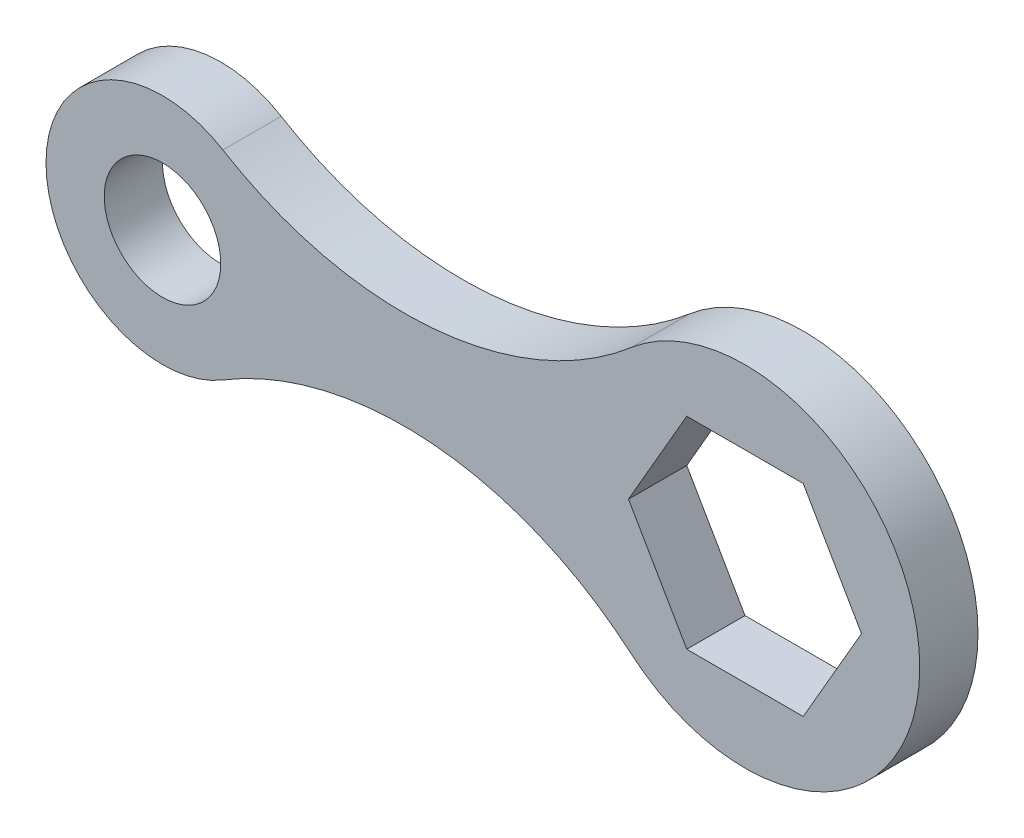
ISO-10303-21;
HEADER;
FILE_DESCRIPTION(('STEP AP214'),'2;1');
FILE_NAME('part.step','',(''),(''),'','','');
FILE_SCHEMA(('AUTOMOTIVE_DESIGN { 1 0 10303 214 1 1 1 1 }'));
ENDSEC;
DATA;
#1=APPLICATION_CONTEXT('core data for automotive mechanical design processes');
#2=APPLICATION_PROTOCOL_DEFINITION('international standard','automotive_design',2000,#1);
#3=PRODUCT_CONTEXT('',#1,'mechanical');
#4=PRODUCT('Part','Part','',(#3));
#5=PRODUCT_RELATED_PRODUCT_CATEGORY('part','',(#4));
#6=PRODUCT_DEFINITION_FORMATION('','',#4);
#7=PRODUCT_DEFINITION_CONTEXT('part definition',#1,'design');
#8=PRODUCT_DEFINITION('design','',#6,#7);
#9=PRODUCT_DEFINITION_SHAPE('','',#8);
#10=(LENGTH_UNIT() NAMED_UNIT(*) SI_UNIT(.MILLI.,.METRE.));
#11=(NAMED_UNIT(*) PLANE_ANGLE_UNIT() SI_UNIT($,.RADIAN.));
#12=(NAMED_UNIT(*) SI_UNIT($,.STERADIAN.) SOLID_ANGLE_UNIT());
#13=UNCERTAINTY_MEASURE_WITH_UNIT(LENGTH_MEASURE(1.E-05),#10,'distance_accuracy_value','');
#14=(GEOMETRIC_REPRESENTATION_CONTEXT(3) GLOBAL_UNCERTAINTY_ASSIGNED_CONTEXT((#13)) GLOBAL_UNIT_ASSIGNED_CONTEXT((#10,
#11,#12)) REPRESENTATION_CONTEXT('',''));
#15=CARTESIAN_POINT('',(0.,0.,0.));
#16=DIRECTION('',(0.,0.,1.));
#17=DIRECTION('',(1.,0.,0.));
#18=AXIS2_PLACEMENT_3D('',#15,#16,#17);
#19=CARTESIAN_POINT('',(-29.25,34.197039345534,5.));
#20=DIRECTION('',(0.,0.,1.));
#21=DIRECTION('',(1.,0.,0.));
#22=AXIS2_PLACEMENT_3D('',#19,#20,#21);
#23=PLANE('',#22);
#24=DIRECTION('',(0.5,-0.866025403784438,0.));
#25=VECTOR('',#24,1.);
#26=CARTESIAN_POINT('',(-20.,0.,5.));
#27=LINE('',#26,#25);
#28=CARTESIAN_POINT('',(-20.,0.,5.));
#29=VERTEX_POINT('',#28);
#30=CARTESIAN_POINT('',(-10.,-17.3205080756888,5.));
#31=VERTEX_POINT('',#30);
#32=EDGE_CURVE('E130',#29,#31,#27,.T.);
#33=ORIENTED_EDGE('',*,*,#32,.F.);
#34=DIRECTION('',(-0.5,-0.866025403784439,0.));
#35=VECTOR('',#34,1.);
#36=CARTESIAN_POINT('',(-10.,17.3205080756888,5.));
#37=LINE('',#36,#35);
#38=CARTESIAN_POINT('',(-10.,17.3205080756888,5.));
#39=VERTEX_POINT('',#38);
#40=EDGE_CURVE('E121',#39,#29,#37,.T.);
#41=ORIENTED_EDGE('',*,*,#40,.F.);
#42=DIRECTION('',(-1.,0.,0.));
#43=VECTOR('',#42,1.);
#44=CARTESIAN_POINT('',(10.,17.3205080756888,5.));
#45=LINE('',#44,#43);
#46=CARTESIAN_POINT('',(10.,17.3205080756888,5.));
#47=VERTEX_POINT('',#46);
#48=EDGE_CURVE('E158',#47,#39,#45,.T.);
#49=ORIENTED_EDGE('',*,*,#48,.F.);
#50=DIRECTION('',(-0.5,0.866025403784438,0.));
#51=VECTOR('',#50,1.);
#52=CARTESIAN_POINT('',(20.,0.,5.));
#53=LINE('',#52,#51);
#54=CARTESIAN_POINT('',(20.,0.,5.));
#55=VERTEX_POINT('',#54);
#56=EDGE_CURVE('E155',#55,#47,#53,.T.);
#57=ORIENTED_EDGE('',*,*,#56,.F.);
#58=DIRECTION('',(0.5,0.866025403784439,0.));
#59=VECTOR('',#58,1.);
#60=CARTESIAN_POINT('',(10.,-17.3205080756888,5.));
#61=LINE('',#60,#59);
#62=CARTESIAN_POINT('',(10.,-17.3205080756888,5.));
#63=VERTEX_POINT('',#62);
#64=EDGE_CURVE('E149',#63,#55,#61,.T.);
#65=ORIENTED_EDGE('',*,*,#64,.F.);
#66=DIRECTION('',(1.,0.,0.));
#67=VECTOR('',#66,1.);
#68=CARTESIAN_POINT('',(-10.,-17.3205080756888,5.));
#69=LINE('',#68,#67);
#70=EDGE_CURVE('E145',#31,#63,#69,.T.);
#71=ORIENTED_EDGE('',*,*,#70,.F.);
#72=EDGE_LOOP('',(#33,#41,#49,#57,#65,#71));
#73=FACE_BOUND('',#72,.T.);
#74=CARTESIAN_POINT('',(-58.5,68.394078691068,5.));
#75=DIRECTION('',(0.,0.,-1.));
#76=DIRECTION('',(1.,0.,0.));
#77=AXIS2_PLACEMENT_3D('',#74,#75,#76);
#78=CIRCLE('',#77,60.);
#79=CARTESIAN_POINT('',(-19.5,22.798026230356,5.));
#80=VERTEX_POINT('',#79);
#81=CARTESIAN_POINT('',(-89.625,17.098519672767,5.));
#82=VERTEX_POINT('',#81);
#83=EDGE_CURVE('E193',#80,#82,#78,.T.);
#84=ORIENTED_EDGE('',*,*,#83,.T.);
#85=CARTESIAN_POINT('',(-100.,0.,5.));
#86=DIRECTION('',(0.,0.,1.));
#87=DIRECTION('',(1.,0.,0.));
#88=AXIS2_PLACEMENT_3D('',#85,#86,#87);
#89=CIRCLE('',#88,20.);
#90=CARTESIAN_POINT('',(-89.625,-17.098519672767,5.));
#91=VERTEX_POINT('',#90);
#92=EDGE_CURVE('E197',#82,#91,#89,.T.);
#93=ORIENTED_EDGE('',*,*,#92,.T.);
#94=CARTESIAN_POINT('',(-58.5,-68.394078691068,5.));
#95=DIRECTION('',(0.,0.,-1.));
#96=DIRECTION('',(-1.,0.,0.));
#97=AXIS2_PLACEMENT_3D('',#94,#95,#96);
#98=CIRCLE('',#97,60.);
#99=CARTESIAN_POINT('',(-19.5,-22.798026230356,5.));
#100=VERTEX_POINT('',#99);
#101=EDGE_CURVE('E201',#91,#100,#98,.T.);
#102=ORIENTED_EDGE('',*,*,#101,.T.);
#103=CARTESIAN_POINT('',(0.,0.,5.));
#104=DIRECTION('',(0.,0.,1.));
#105=DIRECTION('',(1.,0.,0.));
#106=AXIS2_PLACEMENT_3D('',#103,#104,#105);
#107=CIRCLE('',#106,30.);
#108=EDGE_CURVE('E204',#100,#80,#107,.T.);
#109=ORIENTED_EDGE('',*,*,#108,.T.);
#110=EDGE_LOOP('',(#84,#93,#102,#109));
#111=FACE_BOUND('',#110,.T.);
#112=CARTESIAN_POINT('',(-100.,0.,5.));
#113=DIRECTION('',(0.,0.,1.));
#114=DIRECTION('',(1.,0.,0.));
#115=AXIS2_PLACEMENT_3D('',#112,#113,#114);
#116=CIRCLE('',#115,10.);
#117=CARTESIAN_POINT('',(-90.,0.,5.));
#118=VERTEX_POINT('',#117);
#119=EDGE_CURVE('E163',#118,#118,#116,.T.);
#120=ORIENTED_EDGE('',*,*,#119,.F.);
#121=EDGE_LOOP('',(#120));
#122=FACE_BOUND('',#121,.T.);
#123=ADVANCED_FACE('F43',(#73,#111,#122),#23,.T.);
#124=CARTESIAN_POINT('',(-29.25,34.197039345534,-5.));
#125=DIRECTION('',(0.,0.,1.));
#126=DIRECTION('',(1.,0.,0.));
#127=AXIS2_PLACEMENT_3D('',#124,#125,#126);
#128=PLANE('',#127);
#129=CARTESIAN_POINT('',(-58.5,68.394078691068,-5.));
#130=DIRECTION('',(0.,0.,-1.));
#131=DIRECTION('',(1.,0.,0.));
#132=AXIS2_PLACEMENT_3D('',#129,#130,#131);
#133=CIRCLE('',#132,60.);
#134=CARTESIAN_POINT('',(-19.5,22.798026230356,-5.));
#135=VERTEX_POINT('',#134);
#136=CARTESIAN_POINT('',(-89.625,17.098519672767,-5.));
#137=VERTEX_POINT('',#136);
#138=EDGE_CURVE('E139',#135,#137,#133,.T.);
#139=ORIENTED_EDGE('',*,*,#138,.F.);
#140=CARTESIAN_POINT('',(0.,0.,-5.));
#141=DIRECTION('',(0.,0.,1.));
#142=DIRECTION('',(1.,0.,0.));
#143=AXIS2_PLACEMENT_3D('',#140,#141,#142);
#144=CIRCLE('',#143,30.);
#145=CARTESIAN_POINT('',(-19.5,-22.798026230356,-5.));
#146=VERTEX_POINT('',#145);
#147=EDGE_CURVE('E198',#146,#135,#144,.T.);
#148=ORIENTED_EDGE('',*,*,#147,.F.);
#149=CARTESIAN_POINT('',(-58.5,-68.394078691068,-5.));
#150=DIRECTION('',(0.,0.,-1.));
#151=DIRECTION('',(-1.,0.,0.));
#152=AXIS2_PLACEMENT_3D('',#149,#150,#151);
#153=CIRCLE('',#152,60.);
#154=CARTESIAN_POINT('',(-89.625,-17.098519672767,-5.));
#155=VERTEX_POINT('',#154);
#156=EDGE_CURVE('E214',#155,#146,#153,.T.);
#157=ORIENTED_EDGE('',*,*,#156,.F.);
#158=CARTESIAN_POINT('',(-100.,0.,-5.));
#159=DIRECTION('',(0.,0.,1.));
#160=DIRECTION('',(1.,0.,0.));
#161=AXIS2_PLACEMENT_3D('',#158,#159,#160);
#162=CIRCLE('',#161,20.);
#163=EDGE_CURVE('E211',#137,#155,#162,.T.);
#164=ORIENTED_EDGE('',*,*,#163,.F.);
#165=EDGE_LOOP('',(#139,#148,#157,#164));
#166=FACE_BOUND('',#165,.T.);
#167=DIRECTION('',(-0.5,-0.866025403784439,0.));
#168=VECTOR('',#167,1.);
#169=CARTESIAN_POINT('',(-10.,17.3205080756888,-5.));
#170=LINE('',#169,#168);
#171=CARTESIAN_POINT('',(-10.,17.3205080756888,-5.));
#172=VERTEX_POINT('',#171);
#173=CARTESIAN_POINT('',(-20.,0.,-5.));
#174=VERTEX_POINT('',#173);
#175=EDGE_CURVE('E67',#172,#174,#170,.T.);
#176=ORIENTED_EDGE('',*,*,#175,.T.);
#177=DIRECTION('',(0.5,-0.866025403784438,0.));
#178=VECTOR('',#177,1.);
#179=CARTESIAN_POINT('',(-20.,0.,-5.));
#180=LINE('',#179,#178);
#181=CARTESIAN_POINT('',(-10.,-17.3205080756888,-5.));
#182=VERTEX_POINT('',#181);
#183=EDGE_CURVE('E137',#174,#182,#180,.T.);
#184=ORIENTED_EDGE('',*,*,#183,.T.);
#185=DIRECTION('',(1.,0.,0.));
#186=VECTOR('',#185,1.);
#187=CARTESIAN_POINT('',(-10.,-17.3205080756888,-5.));
#188=LINE('',#187,#186);
#189=CARTESIAN_POINT('',(10.,-17.3205080756888,-5.));
#190=VERTEX_POINT('',#189);
#191=EDGE_CURVE('E166',#182,#190,#188,.T.);
#192=ORIENTED_EDGE('',*,*,#191,.T.);
#193=DIRECTION('',(0.5,0.866025403784439,0.));
#194=VECTOR('',#193,1.);
#195=CARTESIAN_POINT('',(10.,-17.3205080756888,-5.));
#196=LINE('',#195,#194);
#197=CARTESIAN_POINT('',(20.,0.,-5.));
#198=VERTEX_POINT('',#197);
#199=EDGE_CURVE('E170',#190,#198,#196,.T.);
#200=ORIENTED_EDGE('',*,*,#199,.T.);
#201=DIRECTION('',(-0.5,0.866025403784438,0.));
#202=VECTOR('',#201,1.);
#203=CARTESIAN_POINT('',(20.,0.,-5.));
#204=LINE('',#203,#202);
#205=CARTESIAN_POINT('',(10.,17.3205080756888,-5.));
#206=VERTEX_POINT('',#205);
#207=EDGE_CURVE('E174',#198,#206,#204,.T.);
#208=ORIENTED_EDGE('',*,*,#207,.T.);
#209=DIRECTION('',(-1.,0.,0.));
#210=VECTOR('',#209,1.);
#211=CARTESIAN_POINT('',(10.,17.3205080756888,-5.));
#212=LINE('',#211,#210);
#213=EDGE_CURVE('E131',#206,#172,#212,.T.);
#214=ORIENTED_EDGE('',*,*,#213,.T.);
#215=EDGE_LOOP('',(#176,#184,#192,#200,#208,#214));
#216=FACE_BOUND('',#215,.T.);
#217=CARTESIAN_POINT('',(-100.,0.,-5.));
#218=DIRECTION('',(0.,0.,1.));
#219=DIRECTION('',(1.,0.,0.));
#220=AXIS2_PLACEMENT_3D('',#217,#218,#219);
#221=CIRCLE('',#220,10.);
#222=CARTESIAN_POINT('',(-90.,0.,-5.));
#223=VERTEX_POINT('',#222);
#224=EDGE_CURVE('E298',#223,#223,#221,.T.);
#225=ORIENTED_EDGE('',*,*,#224,.T.);
#226=EDGE_LOOP('',(#225));
#227=FACE_BOUND('',#226,.T.);
#228=ADVANCED_FACE('F237',(#166,#216,#227),#128,.F.);
#229=CARTESIAN_POINT('',(-58.5,68.394078691068,5.));
#230=DIRECTION('',(0.,0.,-1.));
#231=DIRECTION('',(-1.,0.,0.));
#232=AXIS2_PLACEMENT_3D('',#229,#230,#231);
#233=CYLINDRICAL_SURFACE('',#232,60.);
#234=ORIENTED_EDGE('',*,*,#138,.T.);
#235=DIRECTION('',(0.,0.,-1.));
#236=VECTOR('',#235,1.);
#237=CARTESIAN_POINT('',(-89.625,17.098519672767,5.));
#238=LINE('',#237,#236);
#239=EDGE_CURVE('E11',#82,#137,#238,.T.);
#240=ORIENTED_EDGE('',*,*,#239,.F.);
#241=ORIENTED_EDGE('',*,*,#83,.F.);
#242=DIRECTION('',(0.,0.,-1.));
#243=VECTOR('',#242,1.);
#244=CARTESIAN_POINT('',(-19.5,22.798026230356,5.));
#245=LINE('',#244,#243);
#246=EDGE_CURVE('E207',#80,#135,#245,.T.);
#247=ORIENTED_EDGE('',*,*,#246,.T.);
#248=EDGE_LOOP('',(#234,#240,#241,#247));
#249=FACE_BOUND('',#248,.T.);
#250=ADVANCED_FACE('F45',(#249),#233,.F.);
#251=CARTESIAN_POINT('',(-100.,0.,5.));
#252=DIRECTION('',(0.,0.,-1.));
#253=DIRECTION('',(-1.,0.,0.));
#254=AXIS2_PLACEMENT_3D('',#251,#252,#253);
#255=CYLINDRICAL_SURFACE('',#254,20.);
#256=ORIENTED_EDGE('',*,*,#163,.T.);
#257=DIRECTION('',(0.,0.,-1.));
#258=VECTOR('',#257,1.);
#259=CARTESIAN_POINT('',(-89.625,-17.098519672767,5.));
#260=LINE('',#259,#258);
#261=EDGE_CURVE('E52',#91,#155,#260,.T.);
#262=ORIENTED_EDGE('',*,*,#261,.F.);
#263=ORIENTED_EDGE('',*,*,#92,.F.);
#264=ORIENTED_EDGE('',*,*,#239,.T.);
#265=EDGE_LOOP('',(#256,#262,#263,#264));
#266=FACE_BOUND('',#265,.T.);
#267=ADVANCED_FACE('F247',(#266),#255,.T.);
#268=CARTESIAN_POINT('',(-58.5,-68.394078691068,5.));
#269=DIRECTION('',(0.,0.,-1.));
#270=DIRECTION('',(-1.,0.,0.));
#271=AXIS2_PLACEMENT_3D('',#268,#269,#270);
#272=CYLINDRICAL_SURFACE('',#271,60.);
#273=ORIENTED_EDGE('',*,*,#156,.T.);
#274=DIRECTION('',(0.,0.,-1.));
#275=VECTOR('',#274,1.);
#276=CARTESIAN_POINT('',(-19.5,-22.798026230356,5.));
#277=LINE('',#276,#275);
#278=EDGE_CURVE('E222',#100,#146,#277,.T.);
#279=ORIENTED_EDGE('',*,*,#278,.F.);
#280=ORIENTED_EDGE('',*,*,#101,.F.);
#281=ORIENTED_EDGE('',*,*,#261,.T.);
#282=EDGE_LOOP('',(#273,#279,#280,#281));
#283=FACE_BOUND('',#282,.T.);
#284=ADVANCED_FACE('F231',(#283),#272,.F.);
#285=CARTESIAN_POINT('',(0.,0.,5.));
#286=DIRECTION('',(0.,0.,-1.));
#287=DIRECTION('',(-1.,0.,0.));
#288=AXIS2_PLACEMENT_3D('',#285,#286,#287);
#289=CYLINDRICAL_SURFACE('',#288,30.);
#290=ORIENTED_EDGE('',*,*,#147,.T.);
#291=ORIENTED_EDGE('',*,*,#246,.F.);
#292=ORIENTED_EDGE('',*,*,#108,.F.);
#293=ORIENTED_EDGE('',*,*,#278,.T.);
#294=EDGE_LOOP('',(#290,#291,#292,#293));
#295=FACE_BOUND('',#294,.T.);
#296=ADVANCED_FACE('F241',(#295),#289,.T.);
#297=CARTESIAN_POINT('',(-10.,17.3205080756888,5.));
#298=DIRECTION('',(0.866025403784439,-0.5,0.));
#299=DIRECTION('',(0.5,0.866025403784439,0.));
#300=AXIS2_PLACEMENT_3D('',#297,#298,#299);
#301=PLANE('',#300);
#302=ORIENTED_EDGE('',*,*,#175,.F.);
#303=DIRECTION('',(0.,0.,-1.));
#304=VECTOR('',#303,1.);
#305=CARTESIAN_POINT('',(-10.,17.3205080756888,5.));
#306=LINE('',#305,#304);
#307=EDGE_CURVE('E125',#39,#172,#306,.T.);
#308=ORIENTED_EDGE('',*,*,#307,.F.);
#309=ORIENTED_EDGE('',*,*,#40,.T.);
#310=DIRECTION('',(0.,0.,-1.));
#311=VECTOR('',#310,1.);
#312=CARTESIAN_POINT('',(-20.,0.,5.));
#313=LINE('',#312,#311);
#314=EDGE_CURVE('E124',#29,#174,#313,.T.);
#315=ORIENTED_EDGE('',*,*,#314,.T.);
#316=EDGE_LOOP('',(#302,#308,#309,#315));
#317=FACE_BOUND('',#316,.T.);
#318=ADVANCED_FACE('F123',(#317),#301,.T.);
#319=CARTESIAN_POINT('',(-20.,0.,5.));
#320=DIRECTION('',(0.866025403784439,0.5,0.));
#321=DIRECTION('',(-0.5,0.866025403784439,0.));
#322=AXIS2_PLACEMENT_3D('',#319,#320,#321);
#323=PLANE('',#322);
#324=ORIENTED_EDGE('',*,*,#183,.F.);
#325=ORIENTED_EDGE('',*,*,#314,.F.);
#326=ORIENTED_EDGE('',*,*,#32,.T.);
#327=DIRECTION('',(0.,0.,-1.));
#328=VECTOR('',#327,1.);
#329=CARTESIAN_POINT('',(-10.,-17.3205080756888,5.));
#330=LINE('',#329,#328);
#331=EDGE_CURVE('E140',#31,#182,#330,.T.);
#332=ORIENTED_EDGE('',*,*,#331,.T.);
#333=EDGE_LOOP('',(#324,#325,#326,#332));
#334=FACE_BOUND('',#333,.T.);
#335=ADVANCED_FACE('F134',(#334),#323,.T.);
#336=CARTESIAN_POINT('',(-10.,-17.3205080756888,5.));
#337=DIRECTION('',(0.,1.,0.));
#338=DIRECTION('',(-1.,0.,0.));
#339=AXIS2_PLACEMENT_3D('',#336,#337,#338);
#340=PLANE('',#339);
#341=ORIENTED_EDGE('',*,*,#191,.F.);
#342=ORIENTED_EDGE('',*,*,#331,.F.);
#343=ORIENTED_EDGE('',*,*,#70,.T.);
#344=DIRECTION('',(0.,0.,-1.));
#345=VECTOR('',#344,1.);
#346=CARTESIAN_POINT('',(10.,-17.3205080756888,5.));
#347=LINE('',#346,#345);
#348=EDGE_CURVE('E188',#63,#190,#347,.T.);
#349=ORIENTED_EDGE('',*,*,#348,.T.);
#350=EDGE_LOOP('',(#341,#342,#343,#349));
#351=FACE_BOUND('',#350,.T.);
#352=ADVANCED_FACE('F270',(#351),#340,.T.);
#353=CARTESIAN_POINT('',(10.,-17.3205080756888,5.));
#354=DIRECTION('',(-0.866025403784439,0.5,0.));
#355=DIRECTION('',(-0.5,-0.866025403784439,0.));
#356=AXIS2_PLACEMENT_3D('',#353,#354,#355);
#357=PLANE('',#356);
#358=ORIENTED_EDGE('',*,*,#199,.F.);
#359=ORIENTED_EDGE('',*,*,#348,.F.);
#360=ORIENTED_EDGE('',*,*,#64,.T.);
#361=DIRECTION('',(0.,0.,-1.));
#362=VECTOR('',#361,1.);
#363=CARTESIAN_POINT('',(20.,0.,5.));
#364=LINE('',#363,#362);
#365=EDGE_CURVE('E185',#55,#198,#364,.T.);
#366=ORIENTED_EDGE('',*,*,#365,.T.);
#367=EDGE_LOOP('',(#358,#359,#360,#366));
#368=FACE_BOUND('',#367,.T.);
#369=ADVANCED_FACE('F274',(#368),#357,.T.);
#370=CARTESIAN_POINT('',(20.,0.,5.));
#371=DIRECTION('',(-0.866025403784438,-0.5,0.));
#372=DIRECTION('',(0.5,-0.866025403784439,0.));
#373=AXIS2_PLACEMENT_3D('',#370,#371,#372);
#374=PLANE('',#373);
#375=ORIENTED_EDGE('',*,*,#207,.F.);
#376=ORIENTED_EDGE('',*,*,#365,.F.);
#377=ORIENTED_EDGE('',*,*,#56,.T.);
#378=DIRECTION('',(0.,0.,-1.));
#379=VECTOR('',#378,1.);
#380=CARTESIAN_POINT('',(10.,17.3205080756888,5.));
#381=LINE('',#380,#379);
#382=EDGE_CURVE('E59',#47,#206,#381,.T.);
#383=ORIENTED_EDGE('',*,*,#382,.T.);
#384=EDGE_LOOP('',(#375,#376,#377,#383));
#385=FACE_BOUND('',#384,.T.);
#386=ADVANCED_FACE('F280',(#385),#374,.T.);
#387=CARTESIAN_POINT('',(10.,17.3205080756888,5.));
#388=DIRECTION('',(0.,-1.,0.));
#389=DIRECTION('',(1.,0.,0.));
#390=AXIS2_PLACEMENT_3D('',#387,#388,#389);
#391=PLANE('',#390);
#392=ORIENTED_EDGE('',*,*,#213,.F.);
#393=ORIENTED_EDGE('',*,*,#382,.F.);
#394=ORIENTED_EDGE('',*,*,#48,.T.);
#395=ORIENTED_EDGE('',*,*,#307,.T.);
#396=EDGE_LOOP('',(#392,#393,#394,#395));
#397=FACE_BOUND('',#396,.T.);
#398=ADVANCED_FACE('F284',(#397),#391,.T.);
#399=CARTESIAN_POINT('',(-100.,0.,5.));
#400=DIRECTION('',(0.,0.,-1.));
#401=DIRECTION('',(-1.,0.,0.));
#402=AXIS2_PLACEMENT_3D('',#399,#400,#401);
#403=CYLINDRICAL_SURFACE('',#402,10.);
#404=ORIENTED_EDGE('',*,*,#119,.T.);
#405=EDGE_LOOP('',(#404));
#406=FACE_BOUND('',#405,.T.);
#407=ORIENTED_EDGE('',*,*,#224,.F.);
#408=EDGE_LOOP('',(#407));
#409=FACE_BOUND('',#408,.T.);
#410=ADVANCED_FACE('F288',(#406,#409),#403,.F.);
#411=CLOSED_SHELL('',(#123,#228,#250,#267,#284,#296,#318,#335,#352,#369,#386,#398,#410));
#412=MANIFOLD_SOLID_BREP('B2',#411);
#413=ADVANCED_BREP_SHAPE_REPRESENTATION('',(#18,#412),#14);
#414=SHAPE_DEFINITION_REPRESENTATION(#9,#413);
ENDSEC;
END-ISO-10303-21;
